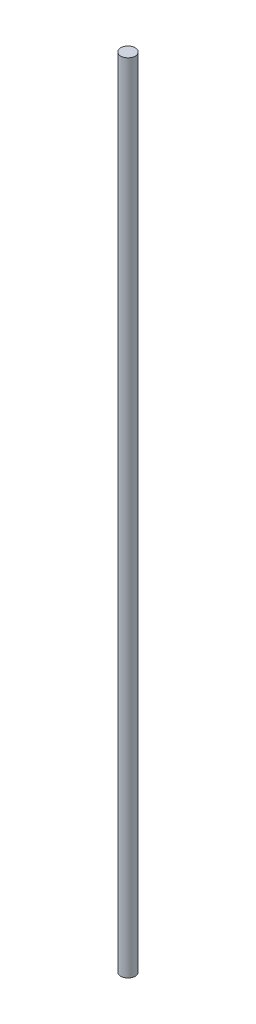
ISO-10303-21;
HEADER;
FILE_DESCRIPTION(('STEP AP214'),'2;1');
FILE_NAME('part.step','',(''),(''),'','','');
FILE_SCHEMA(('AUTOMOTIVE_DESIGN { 1 0 10303 214 1 1 1 1 }'));
ENDSEC;
DATA;
#1=APPLICATION_CONTEXT('core data for automotive mechanical design processes');
#2=APPLICATION_PROTOCOL_DEFINITION('international standard','automotive_design',2000,#1);
#3=PRODUCT_CONTEXT('',#1,'mechanical');
#4=PRODUCT('Part','Part','',(#3));
#5=PRODUCT_RELATED_PRODUCT_CATEGORY('part','',(#4));
#6=PRODUCT_DEFINITION_FORMATION('','',#4);
#7=PRODUCT_DEFINITION_CONTEXT('part definition',#1,'design');
#8=PRODUCT_DEFINITION('design','',#6,#7);
#9=PRODUCT_DEFINITION_SHAPE('','',#8);
#10=(LENGTH_UNIT() NAMED_UNIT(*) SI_UNIT(.MILLI.,.METRE.));
#11=(NAMED_UNIT(*) PLANE_ANGLE_UNIT() SI_UNIT($,.RADIAN.));
#12=(NAMED_UNIT(*) SI_UNIT($,.STERADIAN.) SOLID_ANGLE_UNIT());
#13=UNCERTAINTY_MEASURE_WITH_UNIT(LENGTH_MEASURE(1.E-05),#10,'distance_accuracy_value','');
#14=(GEOMETRIC_REPRESENTATION_CONTEXT(3) GLOBAL_UNCERTAINTY_ASSIGNED_CONTEXT((#13)) GLOBAL_UNIT_ASSIGNED_CONTEXT((#10,
#11,#12)) REPRESENTATION_CONTEXT('',''));
#15=CARTESIAN_POINT('',(0.,0.,0.));
#16=DIRECTION('',(0.,0.,1.));
#17=DIRECTION('',(1.,0.,0.));
#18=AXIS2_PLACEMENT_3D('',#15,#16,#17);
#19=CARTESIAN_POINT('',(0.,550.,0.));
#20=DIRECTION('',(0.,-1.,0.));
#21=DIRECTION('',(0.,0.,-1.));
#22=AXIS2_PLACEMENT_3D('',#19,#20,#21);
#23=CYLINDRICAL_SURFACE('',#22,5.);
#24=CARTESIAN_POINT('',(0.,550.,0.));
#25=DIRECTION('',(0.,1.,0.));
#26=DIRECTION('',(0.,0.,1.));
#27=AXIS2_PLACEMENT_3D('',#24,#25,#26);
#28=CIRCLE('',#27,5.);
#29=CARTESIAN_POINT('',(0.,550.,5.));
#30=VERTEX_POINT('',#29);
#31=EDGE_CURVE('E10',#30,#30,#28,.T.);
#32=ORIENTED_EDGE('',*,*,#31,.F.);
#33=EDGE_LOOP('',(#32));
#34=FACE_BOUND('',#33,.T.);
#35=CARTESIAN_POINT('',(0.,0.,0.));
#36=DIRECTION('',(0.,1.,0.));
#37=DIRECTION('',(0.,0.,1.));
#38=AXIS2_PLACEMENT_3D('',#35,#36,#37);
#39=CIRCLE('',#38,5.);
#40=CARTESIAN_POINT('',(0.,0.,5.));
#41=VERTEX_POINT('',#40);
#42=EDGE_CURVE('E37',#41,#41,#39,.T.);
#43=ORIENTED_EDGE('',*,*,#42,.T.);
#44=EDGE_LOOP('',(#43));
#45=FACE_BOUND('',#44,.T.);
#46=ADVANCED_FACE('F34',(#34,#45),#23,.T.);
#47=CARTESIAN_POINT('',(0.,550.,0.));
#48=DIRECTION('',(0.,1.,0.));
#49=DIRECTION('',(0.,0.,1.));
#50=AXIS2_PLACEMENT_3D('',#47,#48,#49);
#51=PLANE('',#50);
#52=ORIENTED_EDGE('',*,*,#31,.T.);
#53=EDGE_LOOP('',(#52));
#54=FACE_BOUND('',#53,.T.);
#55=ADVANCED_FACE('F49',(#54),#51,.T.);
#56=CARTESIAN_POINT('',(0.,0.,0.));
#57=DIRECTION('',(0.,1.,0.));
#58=DIRECTION('',(0.,0.,1.));
#59=AXIS2_PLACEMENT_3D('',#56,#57,#58);
#60=PLANE('',#59);
#61=ORIENTED_EDGE('',*,*,#42,.F.);
#62=EDGE_LOOP('',(#61));
#63=FACE_BOUND('',#62,.T.);
#64=ADVANCED_FACE('F47',(#63),#60,.F.);
#65=CLOSED_SHELL('',(#46,#55,#64));
#66=MANIFOLD_SOLID_BREP('B2',#65);
#67=ADVANCED_BREP_SHAPE_REPRESENTATION('',(#18,#66),#14);
#68=SHAPE_DEFINITION_REPRESENTATION(#9,#67);
ENDSEC;
END-ISO-10303-21;
